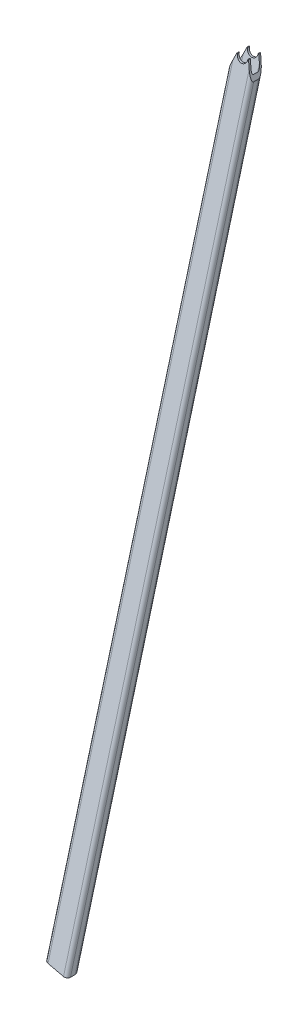
ISO-10303-21;
HEADER;
FILE_DESCRIPTION(('STEP AP214'),'2;1');
FILE_NAME('part.step','',(''),(''),'','','');
FILE_SCHEMA(('AUTOMOTIVE_DESIGN { 1 0 10303 214 1 1 1 1 }'));
ENDSEC;
DATA;
#1=APPLICATION_CONTEXT('core data for automotive mechanical design processes');
#2=APPLICATION_PROTOCOL_DEFINITION('international standard','automotive_design',2000,#1);
#3=PRODUCT_CONTEXT('',#1,'mechanical');
#4=PRODUCT('Part','Part','',(#3));
#5=PRODUCT_RELATED_PRODUCT_CATEGORY('part','',(#4));
#6=PRODUCT_DEFINITION_FORMATION('','',#4);
#7=PRODUCT_DEFINITION_CONTEXT('part definition',#1,'design');
#8=PRODUCT_DEFINITION('design','',#6,#7);
#9=PRODUCT_DEFINITION_SHAPE('','',#8);
#10=(LENGTH_UNIT() NAMED_UNIT(*) SI_UNIT(.MILLI.,.METRE.));
#11=(NAMED_UNIT(*) PLANE_ANGLE_UNIT() SI_UNIT($,.RADIAN.));
#12=(NAMED_UNIT(*) SI_UNIT($,.STERADIAN.) SOLID_ANGLE_UNIT());
#13=UNCERTAINTY_MEASURE_WITH_UNIT(LENGTH_MEASURE(1.E-05),#10,'distance_accuracy_value','');
#14=(GEOMETRIC_REPRESENTATION_CONTEXT(3) GLOBAL_UNCERTAINTY_ASSIGNED_CONTEXT((#13)) GLOBAL_UNIT_ASSIGNED_CONTEXT((#10,
#11,#12)) REPRESENTATION_CONTEXT('',''));
#15=CARTESIAN_POINT('',(0.,0.,0.));
#16=DIRECTION('',(0.,0.,1.));
#17=DIRECTION('',(1.,0.,0.));
#18=AXIS2_PLACEMENT_3D('',#15,#16,#17);
#19=CARTESIAN_POINT('',(0.,0.,0.));
#20=DIRECTION('',(0.,1.,0.));
#21=DIRECTION('',(0.,0.,1.));
#22=AXIS2_PLACEMENT_3D('',#19,#20,#21);
#23=PLANE('',#22);
#24=DIRECTION('',(1.,0.,0.));
#25=VECTOR('',#24,1.);
#26=CARTESIAN_POINT('',(0.,0.,10.3527618041008));
#27=LINE('',#26,#25);
#28=CARTESIAN_POINT('',(9.,0.,10.3527618041008));
#29=VERTEX_POINT('',#28);
#30=CARTESIAN_POINT('',(9.99999999999981,0.,10.3527618041008));
#31=VERTEX_POINT('',#30);
#32=EDGE_CURVE('E264',#29,#31,#27,.T.);
#33=ORIENTED_EDGE('',*,*,#32,.T.);
#34=DIRECTION('',(0.,0.,-1.));
#35=VECTOR('',#34,1.);
#36=CARTESIAN_POINT('',(9.99999999999981,0.,0.));
#37=LINE('',#36,#35);
#38=CARTESIAN_POINT('',(9.99999999999981,0.,7.24693326287058));
#39=VERTEX_POINT('',#38);
#40=EDGE_CURVE('E228',#31,#39,#37,.T.);
#41=ORIENTED_EDGE('',*,*,#40,.T.);
#42=DIRECTION('',(1.,0.,0.));
#43=VECTOR('',#42,1.);
#44=CARTESIAN_POINT('',(0.,0.,7.24693326287058));
#45=LINE('',#44,#43);
#46=CARTESIAN_POINT('',(9.,0.,7.24693326287058));
#47=VERTEX_POINT('',#46);
#48=EDGE_CURVE('E211',#47,#39,#45,.T.);
#49=ORIENTED_EDGE('',*,*,#48,.F.);
#50=DIRECTION('',(0.,0.,1.));
#51=VECTOR('',#50,1.);
#52=CARTESIAN_POINT('',(9.,0.,-10.3527618041008));
#53=LINE('',#52,#51);
#54=EDGE_CURVE('E225',#29,#47,#53,.F.);
#55=ORIENTED_EDGE('',*,*,#54,.F.);
#56=EDGE_LOOP('',(#33,#41,#49,#55));
#57=FACE_BOUND('',#56,.T.);
#58=ADVANCED_FACE('F43',(#57),#23,.T.);
#59=DIRECTION('',(1.,0.,0.));
#60=VECTOR('',#59,1.);
#61=CARTESIAN_POINT('',(0.,0.,-10.3527618041008));
#62=LINE('',#61,#60);
#63=CARTESIAN_POINT('',(-9.99999999999981,0.,-10.3527618041008));
#64=VERTEX_POINT('',#63);
#65=CARTESIAN_POINT('',(-9.,0.,-10.3527618041008));
#66=VERTEX_POINT('',#65);
#67=EDGE_CURVE('E269',#64,#66,#62,.T.);
#68=ORIENTED_EDGE('',*,*,#67,.F.);
#69=DIRECTION('',(0.,0.,1.));
#70=VECTOR('',#69,1.);
#71=CARTESIAN_POINT('',(-9.99999999999981,0.,0.));
#72=LINE('',#71,#70);
#73=CARTESIAN_POINT('',(-9.99999999999981,0.,-7.24693326287058));
#74=VERTEX_POINT('',#73);
#75=EDGE_CURVE('E336',#64,#74,#72,.T.);
#76=ORIENTED_EDGE('',*,*,#75,.T.);
#77=DIRECTION('',(1.,0.,0.));
#78=VECTOR('',#77,1.);
#79=CARTESIAN_POINT('',(0.,0.,-7.24693326287058));
#80=LINE('',#79,#78);
#81=CARTESIAN_POINT('',(-9.,0.,-7.24693326287058));
#82=VERTEX_POINT('',#81);
#83=EDGE_CURVE('E444',#74,#82,#80,.T.);
#84=ORIENTED_EDGE('',*,*,#83,.T.);
#85=DIRECTION('',(0.,0.,1.));
#86=VECTOR('',#85,1.);
#87=CARTESIAN_POINT('',(-9.,0.,-10.3527618041008));
#88=LINE('',#87,#86);
#89=EDGE_CURVE('E241',#66,#82,#88,.T.);
#90=ORIENTED_EDGE('',*,*,#89,.F.);
#91=EDGE_LOOP('',(#68,#76,#84,#90));
#92=FACE_BOUND('',#91,.T.);
#93=ADVANCED_FACE('F524',(#92),#23,.T.);
#94=DIRECTION('',(1.,0.,0.));
#95=VECTOR('',#94,1.);
#96=CARTESIAN_POINT('',(0.,0.,7.24693326287058));
#97=LINE('',#96,#95);
#98=CARTESIAN_POINT('',(-9.99999999999981,0.,7.24693326287058));
#99=VERTEX_POINT('',#98);
#100=CARTESIAN_POINT('',(-9.,0.,7.24693326287058));
#101=VERTEX_POINT('',#100);
#102=EDGE_CURVE('E214',#99,#101,#97,.T.);
#103=ORIENTED_EDGE('',*,*,#102,.F.);
#104=DIRECTION('',(0.,0.,1.));
#105=VECTOR('',#104,1.);
#106=CARTESIAN_POINT('',(-9.99999999999981,0.,0.));
#107=LINE('',#106,#105);
#108=CARTESIAN_POINT('',(-9.99999999999981,0.,10.3527618041008));
#109=VERTEX_POINT('',#108);
#110=EDGE_CURVE('E333',#99,#109,#107,.T.);
#111=ORIENTED_EDGE('',*,*,#110,.T.);
#112=CARTESIAN_POINT('',(-9.,0.,10.3527618041008));
#113=VERTEX_POINT('',#112);
#114=EDGE_CURVE('E265',#109,#113,#27,.T.);
#115=ORIENTED_EDGE('',*,*,#114,.T.);
#116=EDGE_CURVE('E236',#101,#113,#88,.T.);
#117=ORIENTED_EDGE('',*,*,#116,.F.);
#118=EDGE_LOOP('',(#103,#111,#115,#117));
#119=FACE_BOUND('',#118,.T.);
#120=ADVANCED_FACE('F483',(#119),#23,.T.);
#121=CARTESIAN_POINT('',(0.,0.,-10.3527618041008));
#122=DIRECTION('',(0.,0.,1.));
#123=DIRECTION('',(1.,0.,0.));
#124=AXIS2_PLACEMENT_3D('',#121,#122,#123);
#125=CYLINDRICAL_SURFACE('',#124,9.);
#126=CARTESIAN_POINT('',(0.,0.,-7.24693326287058));
#127=DIRECTION('',(0.,-0.258819045102521,-0.965925826289068));
#128=DIRECTION('',(0.,-0.965925826289068,0.258819045102521));
#129=AXIS2_PLACEMENT_3D('',#126,#127,#128);
#130=ELLIPSE('',#129,9.31748562369075,9.);
#131=CARTESIAN_POINT('',(9.,0.,-7.24693326287058));
#132=VERTEX_POINT('',#131);
#133=EDGE_CURVE('E243',#132,#82,#130,.T.);
#134=ORIENTED_EDGE('',*,*,#133,.F.);
#135=CARTESIAN_POINT('',(9.,0.,-10.3527618041008));
#136=VERTEX_POINT('',#135);
#137=EDGE_CURVE('E237',#132,#136,#53,.F.);
#138=ORIENTED_EDGE('',*,*,#137,.T.);
#139=CARTESIAN_POINT('',(0.,0.,-10.3527618041008));
#140=DIRECTION('',(0.,-0.258819045102521,-0.965925826289068));
#141=DIRECTION('',(0.,-0.965925826289068,0.258819045102521));
#142=AXIS2_PLACEMENT_3D('',#139,#140,#141);
#143=ELLIPSE('',#142,9.31748562369075,9.);
#144=EDGE_CURVE('E316',#136,#66,#143,.T.);
#145=ORIENTED_EDGE('',*,*,#144,.T.);
#146=ORIENTED_EDGE('',*,*,#89,.T.);
#147=EDGE_LOOP('',(#134,#138,#145,#146));
#148=FACE_BOUND('',#147,.T.);
#149=ADVANCED_FACE('F533',(#148),#125,.F.);
#150=DIRECTION('',(1.,0.,0.));
#151=VECTOR('',#150,1.);
#152=CARTESIAN_POINT('',(0.,0.,-7.24693326287058));
#153=LINE('',#152,#151);
#154=CARTESIAN_POINT('',(9.99999999999981,0.,-7.24693326287058));
#155=VERTEX_POINT('',#154);
#156=EDGE_CURVE('E413',#132,#155,#153,.T.);
#157=ORIENTED_EDGE('',*,*,#156,.T.);
#158=DIRECTION('',(0.,0.,-1.));
#159=VECTOR('',#158,1.);
#160=CARTESIAN_POINT('',(9.99999999999981,0.,0.));
#161=LINE('',#160,#159);
#162=CARTESIAN_POINT('',(9.99999999999981,0.,-10.3527618041008));
#163=VERTEX_POINT('',#162);
#164=EDGE_CURVE('E376',#155,#163,#161,.T.);
#165=ORIENTED_EDGE('',*,*,#164,.T.);
#166=EDGE_CURVE('E268',#136,#163,#62,.T.);
#167=ORIENTED_EDGE('',*,*,#166,.F.);
#168=ORIENTED_EDGE('',*,*,#137,.F.);
#169=EDGE_LOOP('',(#157,#165,#167,#168));
#170=FACE_BOUND('',#169,.T.);
#171=ADVANCED_FACE('F411',(#170),#23,.T.);
#172=CARTESIAN_POINT('',(-20.,21.9067069768066,4.48287736084025));
#173=DIRECTION('',(-1.,0.,0.));
#174=DIRECTION('',(0.,0.,1.));
#175=AXIS2_PLACEMENT_3D('',#172,#173,#174);
#176=PLANE('',#175);
#177=DIRECTION('',(0.,0.965925826289068,-0.258819045102521));
#178=VECTOR('',#177,1.);
#179=CARTESIAN_POINT('',(-20.,-1.55291427061513,4.55720684636642));
#180=LINE('',#179,#178);
#181=CARTESIAN_POINT('',(-20.,-1196.47346038583,324.735202197295));
#182=VERTEX_POINT('',#181);
#183=CARTESIAN_POINT('',(-20.,-27.474774194547,11.5029482792967));
#184=VERTEX_POINT('',#183);
#185=EDGE_CURVE('E283',#182,#184,#180,.T.);
#186=ORIENTED_EDGE('',*,*,#185,.T.);
#187=DIRECTION('',(0.,0.,-1.));
#188=VECTOR('',#187,1.);
#189=CARTESIAN_POINT('',(-20.,-27.474774194547,4.48287736084025));
#190=LINE('',#189,#188);
#191=CARTESIAN_POINT('',(-20.,-27.474774194547,3.22073883601606));
#192=VERTEX_POINT('',#191);
#193=EDGE_CURVE('E320',#184,#192,#190,.T.);
#194=ORIENTED_EDGE('',*,*,#193,.T.);
#195=DIRECTION('',(0.,0.965925826289068,-0.258819045102521));
#196=VECTOR('',#195,1.);
#197=CARTESIAN_POINT('',(-20.,18.2832403453713,-9.04008420720666));
#198=LINE('',#197,#196);
#199=CARTESIAN_POINT('',(-20.,-1196.47346038583,316.452992754015));
#200=VERTEX_POINT('',#199);
#201=EDGE_CURVE('E287',#192,#200,#198,.F.);
#202=ORIENTED_EDGE('',*,*,#201,.T.);
#203=DIRECTION('',(0.,0.,-1.));
#204=VECTOR('',#203,1.);
#205=CARTESIAN_POINT('',(-20.,-1196.47346038583,4.48287736084025));
#206=LINE('',#205,#204);
#207=EDGE_CURVE('E256',#182,#200,#206,.T.);
#208=ORIENTED_EDGE('',*,*,#207,.F.);
#209=EDGE_LOOP('',(#186,#194,#202,#208));
#210=FACE_BOUND('',#209,.T.);
#211=ADVANCED_FACE('F495',(#210),#176,.T.);
#212=CARTESIAN_POINT('',(20.,21.9067069768066,4.48287736084025));
#213=DIRECTION('',(1.,0.,0.));
#214=DIRECTION('',(0.,0.,-1.));
#215=AXIS2_PLACEMENT_3D('',#212,#213,#214);
#216=PLANE('',#215);
#217=DIRECTION('',(0.,-0.965925826289068,0.258819045102521));
#218=VECTOR('',#217,1.);
#219=CARTESIAN_POINT('',(20.,18.2832403453713,-9.0400842072067));
#220=LINE('',#219,#218);
#221=CARTESIAN_POINT('',(20.,-1203.52653961417,318.342859637401));
#222=VERTEX_POINT('',#221);
#223=CARTESIAN_POINT('',(20.,-27.474774194547,3.22073883601601));
#224=VERTEX_POINT('',#223);
#225=EDGE_CURVE('E305',#222,#224,#220,.F.);
#226=ORIENTED_EDGE('',*,*,#225,.T.);
#227=DIRECTION('',(0.,0.,1.));
#228=VECTOR('',#227,1.);
#229=CARTESIAN_POINT('',(20.,-27.474774194547,4.48287736084025));
#230=LINE('',#229,#228);
#231=CARTESIAN_POINT('',(20.,-27.4747741945467,11.5029482792966));
#232=VERTEX_POINT('',#231);
#233=EDGE_CURVE('E369',#224,#232,#230,.T.);
#234=ORIENTED_EDGE('',*,*,#233,.T.);
#235=DIRECTION('',(0.,-0.965925826289068,0.258819045102521));
#236=VECTOR('',#235,1.);
#237=CARTESIAN_POINT('',(20.,-1205.07945388479,327.041171205408));
#238=LINE('',#237,#236);
#239=CARTESIAN_POINT('',(20.,-1203.52653961417,326.625069080681));
#240=VERTEX_POINT('',#239);
#241=EDGE_CURVE('E302',#232,#240,#238,.T.);
#242=ORIENTED_EDGE('',*,*,#241,.T.);
#243=DIRECTION('',(0.,0.,1.));
#244=VECTOR('',#243,1.);
#245=CARTESIAN_POINT('',(20.,-1203.52653961417,4.48287736084025));
#246=LINE('',#245,#244);
#247=EDGE_CURVE('E252',#222,#240,#246,.T.);
#248=ORIENTED_EDGE('',*,*,#247,.F.);
#249=EDGE_LOOP('',(#226,#234,#242,#248));
#250=FACE_BOUND('',#249,.T.);
#251=ADVANCED_FACE('F508',(#250),#216,.T.);
#252=CARTESIAN_POINT('',(0.,2.58819045102521,9.65925826289068));
#253=DIRECTION('',(0.,-0.258819045102521,-0.965925826289068));
#254=DIRECTION('',(0.,0.965925826289068,-0.258819045102521));
#255=AXIS2_PLACEMENT_3D('',#252,#253,#254);
#256=PLANE('',#255);
#257=ORIENTED_EDGE('',*,*,#114,.F.);
#258=DIRECTION('',(0.331668125174636,0.91125068467017,-0.24416888505968));
#259=VECTOR('',#258,1.);
#260=CARTESIAN_POINT('',(-18.9284544905438,-24.530727103398,16.9257503212046));
#261=LINE('',#260,#259);
#262=CARTESIAN_POINT('',(-14.,-10.989909677819,13.2974992271634));
#263=VERTEX_POINT('',#262);
#264=EDGE_CURVE('E363',#109,#263,#261,.F.);
#265=ORIENTED_EDGE('',*,*,#264,.T.);
#266=DIRECTION('',(0.,0.965925826289068,-0.258819045102521));
#267=VECTOR('',#266,1.);
#268=CARTESIAN_POINT('',(-14.,-1196.47346038583,330.946859279756));
#269=LINE('',#268,#267);
#270=CARTESIAN_POINT('',(-14.,-1197.53142227008,331.230339312264));
#271=VERTEX_POINT('',#270);
#272=EDGE_CURVE('E309',#263,#271,#269,.F.);
#273=ORIENTED_EDGE('',*,*,#272,.T.);
#274=DIRECTION('',(0.983743457179398,-0.173460513596151,0.0464786045367765));
#275=VECTOR('',#274,1.);
#276=CARTESIAN_POINT('',(-219.943870504276,-1161.21796138865,321.500176794704));
#277=LINE('',#276,#275);
#278=CARTESIAN_POINT('',(14.0000000000001,-1202.46857772992,332.553246130634));
#279=VERTEX_POINT('',#278);
#280=EDGE_CURVE('E260',#271,#279,#277,.T.);
#281=ORIENTED_EDGE('',*,*,#280,.T.);
#282=DIRECTION('',(0.,-0.965925826289068,0.258819045102521));
#283=VECTOR('',#282,1.);
#284=CARTESIAN_POINT('',(14.,0.,10.3527618041008));
#285=LINE('',#284,#283);
#286=CARTESIAN_POINT('',(14.,-10.9899096778191,13.2974992271635));
#287=VERTEX_POINT('',#286);
#288=EDGE_CURVE('E312',#279,#287,#285,.F.);
#289=ORIENTED_EDGE('',*,*,#288,.T.);
#290=DIRECTION('',(0.331668125174636,-0.91125068467017,0.24416888505968));
#291=VECTOR('',#290,1.);
#292=CARTESIAN_POINT('',(18.9284544905438,-24.530727103398,16.9257503212046));
#293=LINE('',#292,#291);
#294=EDGE_CURVE('E360',#287,#31,#293,.F.);
#295=ORIENTED_EDGE('',*,*,#294,.T.);
#296=ORIENTED_EDGE('',*,*,#32,.F.);
#297=CARTESIAN_POINT('',(0.,0.,10.3527618041008));
#298=DIRECTION('',(0.,-0.258819045102521,-0.965925826289068));
#299=DIRECTION('',(0.,-0.965925826289068,0.258819045102521));
#300=AXIS2_PLACEMENT_3D('',#297,#298,#299);
#301=ELLIPSE('',#300,9.31748562369075,9.);
#302=EDGE_CURVE('E234',#29,#113,#301,.T.);
#303=ORIENTED_EDGE('',*,*,#302,.T.);
#304=EDGE_LOOP('',(#257,#265,#273,#281,#289,#295,#296,#303));
#305=FACE_BOUND('',#304,.T.);
#306=ADVANCED_FACE('F484',(#305),#256,.F.);
#307=CARTESIAN_POINT('',(0.,-2.58819045102521,-9.65925826289068));
#308=DIRECTION('',(0.,-0.258819045102521,-0.965925826289068));
#309=DIRECTION('',(0.,0.965925826289068,-0.258819045102521));
#310=AXIS2_PLACEMENT_3D('',#307,#308,#309);
#311=PLANE('',#310);
#312=DIRECTION('',(0.,0.965925826289068,-0.258819045102521));
#313=VECTOR('',#312,1.);
#314=CARTESIAN_POINT('',(-14.,-2.58819045102521,-9.65925826289068));
#315=LINE('',#314,#313);
#316=CARTESIAN_POINT('',(-14.,-1197.53142227008,310.524815704062));
#317=VERTEX_POINT('',#316);
#318=CARTESIAN_POINT('',(-14.,-10.9899096778191,-7.40802438103821));
#319=VERTEX_POINT('',#318);
#320=EDGE_CURVE('E279',#317,#319,#315,.T.);
#321=ORIENTED_EDGE('',*,*,#320,.T.);
#322=DIRECTION('',(-0.331668125174636,-0.91125068467017,0.24416888505968));
#323=VECTOR('',#322,1.);
#324=CARTESIAN_POINT('',(-9.73836063276715,0.718848253512128,-10.5453766131099));
#325=LINE('',#324,#323);
#326=EDGE_CURVE('E330',#319,#64,#325,.F.);
#327=ORIENTED_EDGE('',*,*,#326,.T.);
#328=ORIENTED_EDGE('',*,*,#67,.T.);
#329=ORIENTED_EDGE('',*,*,#144,.F.);
#330=ORIENTED_EDGE('',*,*,#166,.T.);
#331=DIRECTION('',(-0.331668125174636,0.91125068467017,-0.24416888505968));
#332=VECTOR('',#331,1.);
#333=CARTESIAN_POINT('',(9.73836063276715,0.718848253512128,-10.5453766131099));
#334=LINE('',#333,#332);
#335=CARTESIAN_POINT('',(14.,-10.9899096778191,-7.40802438103821));
#336=VERTEX_POINT('',#335);
#337=EDGE_CURVE('E327',#163,#336,#334,.F.);
#338=ORIENTED_EDGE('',*,*,#337,.T.);
#339=DIRECTION('',(0.,-0.965925826289068,0.258819045102521));
#340=VECTOR('',#339,1.);
#341=CARTESIAN_POINT('',(14.,-2.58819045102521,-9.65925826289068));
#342=LINE('',#341,#340);
#343=CARTESIAN_POINT('',(14.0000000000001,-1202.46857772992,311.847722522432));
#344=VERTEX_POINT('',#343);
#345=EDGE_CURVE('E276',#336,#344,#342,.T.);
#346=ORIENTED_EDGE('',*,*,#345,.T.);
#347=DIRECTION('',(0.983743457179398,-0.173460513596151,0.0464786045367765));
#348=VECTOR('',#347,1.);
#349=CARTESIAN_POINT('',(-218.997151369795,-1161.38489351521,300.839382515006));
#350=LINE('',#349,#348);
#351=EDGE_CURVE('E272',#317,#344,#350,.T.);
#352=ORIENTED_EDGE('',*,*,#351,.F.);
#353=EDGE_LOOP('',(#321,#327,#328,#329,#330,#338,#346,#352));
#354=FACE_BOUND('',#353,.T.);
#355=ADVANCED_FACE('F416',(#354),#311,.T.);
#356=CARTESIAN_POINT('',(-205.212085995402,-1163.81557247155,0.));
#357=DIRECTION('',(0.173648177666931,0.984807753012208,0.));
#358=DIRECTION('',(-0.984807753012208,0.173648177666931,0.));
#359=AXIS2_PLACEMENT_3D('',#356,#357,#358);
#360=PLANE('',#359);
#361=DIRECTION('',(0.,0.,-1.));
#362=VECTOR('',#361,1.);
#363=CARTESIAN_POINT('',(-17.,-1197.00244132796,4.48287736084025));
#364=LINE('',#363,#362);
#365=CARTESIAN_POINT('',(-17.,-1197.00244132796,324.876942213549));
#366=VERTEX_POINT('',#365);
#367=CARTESIAN_POINT('',(-17.,-1197.00244132796,316.594732770269));
#368=VERTEX_POINT('',#367);
#369=EDGE_CURVE('E448',#366,#368,#364,.T.);
#370=ORIENTED_EDGE('',*,*,#369,.F.);
#371=CARTESIAN_POINT('',(-14.,-1197.53142227008,325.018682229803));
#372=DIRECTION('',(0.173648177666931,0.984807753012208,0.));
#373=DIRECTION('',(0.535583384778492,-0.0944378011556117,0.839185283273073));
#374=AXIS2_PLACEMENT_3D('',#371,#372,#373);
#375=ELLIPSE('',#374,3.15374095271948,3.);
#376=CARTESIAN_POINT('',(-14.,-1197.53142227008,328.124510771034));
#377=VERTEX_POINT('',#376);
#378=EDGE_CURVE('E245',#377,#366,#375,.F.);
#379=ORIENTED_EDGE('',*,*,#378,.F.);
#380=DIRECTION('',(0.983743457179398,-0.173460513596151,0.0464786045367765));
#381=VECTOR('',#380,1.);
#382=CARTESIAN_POINT('',(-219.801862634104,-1161.24300120763,318.40105765275));
#383=LINE('',#382,#381);
#384=CARTESIAN_POINT('',(14.0000000000001,-1202.46857772992,329.447417589404));
#385=VERTEX_POINT('',#384);
#386=EDGE_CURVE('E230',#377,#385,#383,.T.);
#387=ORIENTED_EDGE('',*,*,#386,.T.);
#388=CARTESIAN_POINT('',(14.,-1202.46857772992,326.341589048174));
#389=DIRECTION('',(0.173648177666931,0.984807753012208,0.));
#390=DIRECTION('',(-0.535583384778492,0.0944378011556117,-0.839185283273073));
#391=AXIS2_PLACEMENT_3D('',#388,#389,#390);
#392=ELLIPSE('',#391,3.15374095271948,3.);
#393=CARTESIAN_POINT('',(17.,-1202.99755867204,326.483329064427));
#394=VERTEX_POINT('',#393);
#395=EDGE_CURVE('E428',#394,#385,#392,.F.);
#396=ORIENTED_EDGE('',*,*,#395,.F.);
#397=DIRECTION('',(0.,0.,1.));
#398=VECTOR('',#397,1.);
#399=CARTESIAN_POINT('',(17.,-1202.99755867204,4.48287736084025));
#400=LINE('',#399,#398);
#401=CARTESIAN_POINT('',(17.,-1202.99755867204,318.201119621147));
#402=VERTEX_POINT('',#401);
#403=EDGE_CURVE('E220',#402,#394,#400,.T.);
#404=ORIENTED_EDGE('',*,*,#403,.F.);
#405=CARTESIAN_POINT('',(14.,-1202.46857772992,318.059379604893));
#406=DIRECTION('',(0.173648177666931,0.984807753012208,0.));
#407=DIRECTION('',(0.535583384778492,-0.0944378011556117,0.839185283273073));
#408=AXIS2_PLACEMENT_3D('',#405,#406,#407);
#409=ELLIPSE('',#408,3.15374095271948,3.);
#410=CARTESIAN_POINT('',(14.,-1202.46857772992,314.953551063663));
#411=VERTEX_POINT('',#410);
#412=EDGE_CURVE('E455',#411,#402,#409,.F.);
#413=ORIENTED_EDGE('',*,*,#412,.F.);
#414=DIRECTION('',(0.983743457179398,-0.173460513596151,0.0464786045367765));
#415=VECTOR('',#414,1.);
#416=CARTESIAN_POINT('',(-219.139159239967,-1161.35985369623,303.93850165696));
#417=LINE('',#416,#415);
#418=CARTESIAN_POINT('',(-14.,-1197.53142227008,313.630644245292));
#419=VERTEX_POINT('',#418);
#420=EDGE_CURVE('E400',#419,#411,#417,.T.);
#421=ORIENTED_EDGE('',*,*,#420,.F.);
#422=CARTESIAN_POINT('',(-14.,-1197.53142227008,316.736472786523));
#423=DIRECTION('',(0.173648177666931,0.984807753012208,0.));
#424=DIRECTION('',(-0.535583384778492,0.0944378011556117,-0.839185283273073));
#425=AXIS2_PLACEMENT_3D('',#422,#423,#424);
#426=ELLIPSE('',#425,3.15374095271948,3.);
#427=EDGE_CURVE('E452',#368,#419,#426,.F.);
#428=ORIENTED_EDGE('',*,*,#427,.F.);
#429=EDGE_LOOP('',(#370,#379,#387,#396,#404,#413,#421,#428));
#430=FACE_BOUND('',#429,.T.);
#431=ORIENTED_EDGE('',*,*,#207,.T.);
#432=CARTESIAN_POINT('',(-14.,-1197.53142227008,316.736472786523));
#433=DIRECTION('',(0.173648177666931,0.984807753012208,0.));
#434=DIRECTION('',(-0.535583384778492,0.0944378011556117,-0.839185283273073));
#435=AXIS2_PLACEMENT_3D('',#432,#433,#434);
#436=ELLIPSE('',#435,6.30748190543896,6.);
#437=EDGE_CURVE('E299',#200,#317,#436,.F.);
#438=ORIENTED_EDGE('',*,*,#437,.T.);
#439=ORIENTED_EDGE('',*,*,#351,.T.);
#440=CARTESIAN_POINT('',(14.,-1202.46857772992,318.059379604893));
#441=DIRECTION('',(0.173648177666931,0.984807753012208,0.));
#442=DIRECTION('',(0.535583384778492,-0.0944378011556117,0.839185283273073));
#443=AXIS2_PLACEMENT_3D('',#440,#441,#442);
#444=ELLIPSE('',#443,6.30748190543896,6.);
#445=EDGE_CURVE('E296',#344,#222,#444,.F.);
#446=ORIENTED_EDGE('',*,*,#445,.T.);
#447=ORIENTED_EDGE('',*,*,#247,.T.);
#448=CARTESIAN_POINT('',(14.,-1202.46857772992,326.341589048174));
#449=DIRECTION('',(0.173648177666931,0.984807753012208,0.));
#450=DIRECTION('',(-0.535583384778492,0.0944378011556117,-0.839185283273073));
#451=AXIS2_PLACEMENT_3D('',#448,#449,#450);
#452=ELLIPSE('',#451,6.30748190543896,6.);
#453=EDGE_CURVE('E293',#240,#279,#452,.F.);
#454=ORIENTED_EDGE('',*,*,#453,.T.);
#455=ORIENTED_EDGE('',*,*,#280,.F.);
#456=CARTESIAN_POINT('',(-14.,-1197.53142227008,325.018682229803));
#457=DIRECTION('',(0.173648177666931,0.984807753012208,0.));
#458=DIRECTION('',(0.535583384778492,-0.0944378011556117,0.839185283273073));
#459=AXIS2_PLACEMENT_3D('',#456,#457,#458);
#460=ELLIPSE('',#459,6.30748190543896,6.);
#461=EDGE_CURVE('E290',#271,#182,#460,.F.);
#462=ORIENTED_EDGE('',*,*,#461,.T.);
#463=EDGE_LOOP('',(#431,#438,#439,#446,#447,#454,#455,#462));
#464=FACE_BOUND('',#463,.T.);
#465=ADVANCED_FACE('F468',(#430,#464),#360,.F.);
#466=CARTESIAN_POINT('',(-14.,-1.03527618041009,-3.86370330515627));
#467=DIRECTION('',(0.,0.965925826289068,-0.258819045102521));
#468=DIRECTION('',(0.,0.258819045102521,0.965925826289068));
#469=AXIS2_PLACEMENT_3D('',#466,#467,#468);
#470=CYLINDRICAL_SURFACE('',#469,6.);
#471=ORIENTED_EDGE('',*,*,#201,.F.);
#472=CARTESIAN_POINT('',(-14.,-10.9899096778191,-1.19636729857771));
#473=DIRECTION('',(0.939692620785909,-0.342020143325666,0.));
#474=DIRECTION('',(0.328909923583208,0.903672588079418,-0.27421545492976));
#475=AXIS2_PLACEMENT_3D('',#472,#473,#474);
#476=ELLIPSE('',#475,18.1616703100024,6.);
#477=EDGE_CURVE('E324',#192,#319,#476,.T.);
#478=ORIENTED_EDGE('',*,*,#477,.T.);
#479=ORIENTED_EDGE('',*,*,#320,.F.);
#480=ORIENTED_EDGE('',*,*,#437,.F.);
#481=EDGE_LOOP('',(#471,#478,#479,#480));
#482=FACE_BOUND('',#481,.T.);
#483=ADVANCED_FACE('F499',(#482),#470,.T.);
#484=CARTESIAN_POINT('',(14.,-1.03527618041009,-3.86370330515627));
#485=DIRECTION('',(0.,-0.965925826289068,0.258819045102521));
#486=DIRECTION('',(0.,-0.258819045102521,-0.965925826289068));
#487=AXIS2_PLACEMENT_3D('',#484,#485,#486);
#488=CYLINDRICAL_SURFACE('',#487,6.);
#489=ORIENTED_EDGE('',*,*,#345,.F.);
#490=CARTESIAN_POINT('',(14.,-10.9899096778191,-1.19636729857771));
#491=DIRECTION('',(-0.939692620785909,-0.342020143325666,0.));
#492=DIRECTION('',(0.328909923583208,-0.903672588079418,0.27421545492976));
#493=AXIS2_PLACEMENT_3D('',#490,#491,#492);
#494=ELLIPSE('',#493,18.1616703100024,6.);
#495=EDGE_CURVE('E12',#336,#224,#494,.T.);
#496=ORIENTED_EDGE('',*,*,#495,.T.);
#497=ORIENTED_EDGE('',*,*,#225,.F.);
#498=ORIENTED_EDGE('',*,*,#445,.F.);
#499=EDGE_LOOP('',(#489,#496,#497,#498));
#500=FACE_BOUND('',#499,.T.);
#501=ADVANCED_FACE('F505',(#500),#488,.T.);
#502=CARTESIAN_POINT('',(14.,20.3537927061915,-1.31267759689415));
#503=DIRECTION('',(0.,0.965925826289068,-0.258819045102521));
#504=DIRECTION('',(0.,0.258819045102521,0.965925826289068));
#505=AXIS2_PLACEMENT_3D('',#502,#503,#504);
#506=CYLINDRICAL_SURFACE('',#505,6.);
#507=ORIENTED_EDGE('',*,*,#241,.F.);
#508=CARTESIAN_POINT('',(14.,-10.9899096778191,7.08584214470295));
#509=DIRECTION('',(-0.939692620785909,-0.342020143325666,0.));
#510=DIRECTION('',(-0.328909923583208,0.903672588079418,-0.27421545492976));
#511=AXIS2_PLACEMENT_3D('',#508,#509,#510);
#512=ELLIPSE('',#511,18.1616703100024,6.);
#513=EDGE_CURVE('E373',#232,#287,#512,.T.);
#514=ORIENTED_EDGE('',*,*,#513,.T.);
#515=ORIENTED_EDGE('',*,*,#288,.F.);
#516=ORIENTED_EDGE('',*,*,#453,.F.);
#517=EDGE_LOOP('',(#507,#514,#515,#516));
#518=FACE_BOUND('',#517,.T.);
#519=ADVANCED_FACE('F514',(#518),#506,.T.);
#520=CARTESIAN_POINT('',(-14.,20.3537927061915,-1.31267759689415));
#521=DIRECTION('',(0.,-0.965925826289068,0.258819045102521));
#522=DIRECTION('',(0.,-0.258819045102521,-0.965925826289068));
#523=AXIS2_PLACEMENT_3D('',#520,#521,#522);
#524=CYLINDRICAL_SURFACE('',#523,6.);
#525=ORIENTED_EDGE('',*,*,#272,.F.);
#526=CARTESIAN_POINT('',(-14.,-10.9899096778191,7.08584214470295));
#527=DIRECTION('',(0.939692620785909,-0.342020143325666,0.));
#528=DIRECTION('',(-0.328909923583208,-0.903672588079418,0.27421545492976));
#529=AXIS2_PLACEMENT_3D('',#526,#527,#528);
#530=ELLIPSE('',#529,18.1616703100024,6.);
#531=EDGE_CURVE('E366',#263,#184,#530,.T.);
#532=ORIENTED_EDGE('',*,*,#531,.T.);
#533=ORIENTED_EDGE('',*,*,#185,.F.);
#534=ORIENTED_EDGE('',*,*,#461,.F.);
#535=EDGE_LOOP('',(#525,#532,#533,#534));
#536=FACE_BOUND('',#535,.T.);
#537=ADVANCED_FACE('F489',(#536),#524,.T.);
#538=ORIENTED_EDGE('',*,*,#54,.T.);
#539=CARTESIAN_POINT('',(0.,0.,7.24693326287058));
#540=DIRECTION('',(0.,-0.258819045102521,-0.965925826289068));
#541=DIRECTION('',(0.,-0.965925826289068,0.258819045102521));
#542=AXIS2_PLACEMENT_3D('',#539,#540,#541);
#543=ELLIPSE('',#542,9.31748562369075,9.);
#544=EDGE_CURVE('E207',#47,#101,#543,.T.);
#545=ORIENTED_EDGE('',*,*,#544,.T.);
#546=ORIENTED_EDGE('',*,*,#116,.T.);
#547=ORIENTED_EDGE('',*,*,#302,.F.);
#548=EDGE_LOOP('',(#538,#545,#546,#547));
#549=FACE_BOUND('',#548,.T.);
#550=ADVANCED_FACE('F232',(#549),#125,.F.);
#551=CARTESIAN_POINT('',(-17.,21.9067069768066,4.48287736084025));
#552=DIRECTION('',(-1.,0.,0.));
#553=DIRECTION('',(0.,0.,1.));
#554=AXIS2_PLACEMENT_3D('',#551,#552,#553);
#555=PLANE('',#554);
#556=DIRECTION('',(0.,0.965925826289068,-0.258819045102521));
#557=VECTOR('',#556,1.);
#558=CARTESIAN_POINT('',(-17.,-1.03527618041008,-3.86370330515625));
#559=LINE('',#558,#557);
#560=CARTESIAN_POINT('',(-17.,-19.2323419361831,1.01218576871918));
#561=VERTEX_POINT('',#560);
#562=EDGE_CURVE('E725',#561,#368,#559,.F.);
#563=ORIENTED_EDGE('',*,*,#562,.F.);
#564=DIRECTION('',(0.,0.,-1.));
#565=VECTOR('',#564,1.);
#566=CARTESIAN_POINT('',(-17.,-19.2323419361831,4.48287736084025));
#567=LINE('',#566,#565);
#568=CARTESIAN_POINT('',(-17.,-19.2323419361831,9.29439521199982));
#569=VERTEX_POINT('',#568);
#570=EDGE_CURVE('E348',#561,#569,#567,.F.);
#571=ORIENTED_EDGE('',*,*,#570,.T.);
#572=DIRECTION('',(0.,-0.965925826289068,0.258819045102521));
#573=VECTOR('',#572,1.);
#574=CARTESIAN_POINT('',(-17.,20.3537927061915,-1.31267759689415));
#575=LINE('',#574,#573);
#576=EDGE_CURVE('E730',#366,#569,#575,.F.);
#577=ORIENTED_EDGE('',*,*,#576,.F.);
#578=ORIENTED_EDGE('',*,*,#369,.T.);
#579=EDGE_LOOP('',(#563,#571,#577,#578));
#580=FACE_BOUND('',#579,.T.);
#581=ADVANCED_FACE('F569',(#580),#555,.F.);
#582=CARTESIAN_POINT('',(17.,21.9067069768066,4.48287736084025));
#583=DIRECTION('',(1.,0.,0.));
#584=DIRECTION('',(0.,0.,-1.));
#585=AXIS2_PLACEMENT_3D('',#582,#583,#584);
#586=PLANE('',#585);
#587=DIRECTION('',(0.,0.965925826289068,-0.258819045102521));
#588=VECTOR('',#587,1.);
#589=CARTESIAN_POINT('',(17.,20.3537927061915,-1.31267759689414));
#590=LINE('',#589,#588);
#591=CARTESIAN_POINT('',(17.,-19.2323419361831,9.29439521199983));
#592=VERTEX_POINT('',#591);
#593=EDGE_CURVE('E438',#592,#394,#590,.F.);
#594=ORIENTED_EDGE('',*,*,#593,.F.);
#595=DIRECTION('',(0.,0.,1.));
#596=VECTOR('',#595,1.);
#597=CARTESIAN_POINT('',(17.,-19.2323419361831,4.48287736084025));
#598=LINE('',#597,#596);
#599=CARTESIAN_POINT('',(17.,-19.2323419361831,1.01218576871918));
#600=VERTEX_POINT('',#599);
#601=EDGE_CURVE('E60',#592,#600,#598,.F.);
#602=ORIENTED_EDGE('',*,*,#601,.T.);
#603=DIRECTION('',(0.,-0.965925826289068,0.258819045102521));
#604=VECTOR('',#603,1.);
#605=CARTESIAN_POINT('',(17.,-1.03527618041008,-3.86370330515625));
#606=LINE('',#605,#604);
#607=EDGE_CURVE('E391',#402,#600,#606,.F.);
#608=ORIENTED_EDGE('',*,*,#607,.F.);
#609=ORIENTED_EDGE('',*,*,#403,.T.);
#610=EDGE_LOOP('',(#594,#602,#608,#609));
#611=FACE_BOUND('',#610,.T.);
#612=ADVANCED_FACE('F629',(#611),#586,.F.);
#613=CARTESIAN_POINT('',(0.,1.81173331571765,6.76148078402348));
#614=DIRECTION('',(0.,-0.258819045102521,-0.965925826289068));
#615=DIRECTION('',(0.,0.965925826289068,-0.258819045102521));
#616=AXIS2_PLACEMENT_3D('',#613,#614,#615);
#617=PLANE('',#616);
#618=DIRECTION('',(0.,0.965925826289068,-0.258819045102521));
#619=VECTOR('',#618,1.);
#620=CARTESIAN_POINT('',(-14.,1.81173331571765,6.76148078402348));
#621=LINE('',#620,#619);
#622=CARTESIAN_POINT('',(-14.,-10.9899096778191,10.1916706859332));
#623=VERTEX_POINT('',#622);
#624=EDGE_CURVE('E430',#623,#377,#621,.F.);
#625=ORIENTED_EDGE('',*,*,#624,.F.);
#626=DIRECTION('',(-0.331668125174636,-0.91125068467017,0.24416888505968));
#627=VECTOR('',#626,1.);
#628=CARTESIAN_POINT('',(-8.31308388769612,4.63476392706861,6.00505201150365));
#629=LINE('',#628,#627);
#630=EDGE_CURVE('E357',#623,#99,#629,.F.);
#631=ORIENTED_EDGE('',*,*,#630,.T.);
#632=ORIENTED_EDGE('',*,*,#102,.T.);
#633=ORIENTED_EDGE('',*,*,#544,.F.);
#634=ORIENTED_EDGE('',*,*,#48,.T.);
#635=DIRECTION('',(-0.331668125174636,0.91125068467017,-0.24416888505968));
#636=VECTOR('',#635,1.);
#637=CARTESIAN_POINT('',(8.31308388769612,4.63476392706861,6.00505201150365));
#638=LINE('',#637,#636);
#639=CARTESIAN_POINT('',(14.0000000000001,-10.9899096778193,10.1916706859333));
#640=VERTEX_POINT('',#639);
#641=EDGE_CURVE('E354',#39,#640,#638,.F.);
#642=ORIENTED_EDGE('',*,*,#641,.T.);
#643=DIRECTION('',(0.,0.965925826289068,-0.258819045102521));
#644=VECTOR('',#643,1.);
#645=CARTESIAN_POINT('',(14.0000000000001,1.81173331571765,6.76148078402348));
#646=LINE('',#645,#644);
#647=EDGE_CURVE('E424',#385,#640,#646,.T.);
#648=ORIENTED_EDGE('',*,*,#647,.F.);
#649=ORIENTED_EDGE('',*,*,#386,.F.);
#650=EDGE_LOOP('',(#625,#631,#632,#633,#634,#642,#648,#649));
#651=FACE_BOUND('',#650,.T.);
#652=ADVANCED_FACE('F210',(#651),#617,.T.);
#653=CARTESIAN_POINT('',(0.,-1.81173331571765,-6.76148078402348));
#654=DIRECTION('',(0.,-0.258819045102521,-0.965925826289068));
#655=DIRECTION('',(0.,0.965925826289068,-0.258819045102521));
#656=AXIS2_PLACEMENT_3D('',#653,#654,#655);
#657=PLANE('',#656);
#658=ORIENTED_EDGE('',*,*,#83,.F.);
#659=DIRECTION('',(0.331668125174636,0.91125068467017,-0.24416888505968));
#660=VECTOR('',#659,1.);
#661=CARTESIAN_POINT('',(-20.3537312356148,-28.4466427769545,0.375321696591021));
#662=LINE('',#661,#660);
#663=CARTESIAN_POINT('',(-14.,-10.9899096778192,-4.30219583980795));
#664=VERTEX_POINT('',#663);
#665=EDGE_CURVE('E342',#74,#664,#662,.F.);
#666=ORIENTED_EDGE('',*,*,#665,.T.);
#667=DIRECTION('',(0.,0.965925826289068,-0.258819045102521));
#668=VECTOR('',#667,1.);
#669=CARTESIAN_POINT('',(-14.,-1.81173331571765,-6.76148078402348));
#670=LINE('',#669,#668);
#671=EDGE_CURVE('E403',#419,#664,#670,.T.);
#672=ORIENTED_EDGE('',*,*,#671,.F.);
#673=ORIENTED_EDGE('',*,*,#420,.T.);
#674=DIRECTION('',(0.,0.965925826289068,-0.258819045102521));
#675=VECTOR('',#674,1.);
#676=CARTESIAN_POINT('',(14.,-1.81173331571765,-6.76148078402348));
#677=LINE('',#676,#675);
#678=CARTESIAN_POINT('',(14.,-10.9899096778191,-4.30219583980796));
#679=VERTEX_POINT('',#678);
#680=EDGE_CURVE('E389',#679,#411,#677,.F.);
#681=ORIENTED_EDGE('',*,*,#680,.F.);
#682=DIRECTION('',(0.331668125174636,-0.91125068467017,0.24416888505968));
#683=VECTOR('',#682,1.);
#684=CARTESIAN_POINT('',(20.3537312356148,-28.4466427769545,0.375321696591021));
#685=LINE('',#684,#683);
#686=EDGE_CURVE('E339',#679,#155,#685,.F.);
#687=ORIENTED_EDGE('',*,*,#686,.T.);
#688=ORIENTED_EDGE('',*,*,#156,.F.);
#689=ORIENTED_EDGE('',*,*,#133,.T.);
#690=EDGE_LOOP('',(#658,#666,#672,#673,#681,#687,#688,#689));
#691=FACE_BOUND('',#690,.T.);
#692=ADVANCED_FACE('F396',(#691),#657,.F.);
#693=CARTESIAN_POINT('',(-14.,-1.03527618041009,-3.86370330515627));
#694=DIRECTION('',(0.,0.965925826289068,-0.258819045102521));
#695=DIRECTION('',(0.,0.258819045102521,0.965925826289068));
#696=AXIS2_PLACEMENT_3D('',#693,#694,#695);
#697=CYLINDRICAL_SURFACE('',#696,3.);
#698=ORIENTED_EDGE('',*,*,#671,.T.);
#699=CARTESIAN_POINT('',(-14.,-10.9899096778191,-1.19636729857771));
#700=DIRECTION('',(0.939692620785909,-0.342020143325666,0.));
#701=DIRECTION('',(0.328909923583208,0.903672588079418,-0.27421545492976));
#702=AXIS2_PLACEMENT_3D('',#699,#700,#701);
#703=ELLIPSE('',#702,9.08083515500118,3.);
#704=EDGE_CURVE('E345',#664,#561,#703,.F.);
#705=ORIENTED_EDGE('',*,*,#704,.T.);
#706=ORIENTED_EDGE('',*,*,#562,.T.);
#707=ORIENTED_EDGE('',*,*,#427,.T.);
#708=EDGE_LOOP('',(#698,#705,#706,#707));
#709=FACE_BOUND('',#708,.T.);
#710=ADVANCED_FACE('F606',(#709),#697,.F.);
#711=CARTESIAN_POINT('',(14.,-1.03527618041009,-3.86370330515627));
#712=DIRECTION('',(0.,-0.965925826289068,0.258819045102521));
#713=DIRECTION('',(0.,-0.258819045102521,-0.965925826289068));
#714=AXIS2_PLACEMENT_3D('',#711,#712,#713);
#715=CYLINDRICAL_SURFACE('',#714,3.);
#716=ORIENTED_EDGE('',*,*,#607,.T.);
#717=CARTESIAN_POINT('',(14.,-10.9899096778191,-1.19636729857771));
#718=DIRECTION('',(-0.939692620785909,-0.342020143325666,0.));
#719=DIRECTION('',(0.328909923583208,-0.903672588079418,0.27421545492976));
#720=AXIS2_PLACEMENT_3D('',#717,#718,#719);
#721=ELLIPSE('',#720,9.08083515500118,3.);
#722=EDGE_CURVE('E53',#600,#679,#721,.F.);
#723=ORIENTED_EDGE('',*,*,#722,.T.);
#724=ORIENTED_EDGE('',*,*,#680,.T.);
#725=ORIENTED_EDGE('',*,*,#412,.T.);
#726=EDGE_LOOP('',(#716,#723,#724,#725));
#727=FACE_BOUND('',#726,.T.);
#728=ADVANCED_FACE('F388',(#727),#715,.F.);
#729=CARTESIAN_POINT('',(14.,20.3537927061915,-1.31267759689415));
#730=DIRECTION('',(0.,0.965925826289068,-0.258819045102521));
#731=DIRECTION('',(0.,0.258819045102521,0.965925826289068));
#732=AXIS2_PLACEMENT_3D('',#729,#730,#731);
#733=CYLINDRICAL_SURFACE('',#732,3.);
#734=ORIENTED_EDGE('',*,*,#647,.T.);
#735=CARTESIAN_POINT('',(14.,-10.9899096778191,7.08584214470295));
#736=DIRECTION('',(-0.939692620785909,-0.342020143325666,0.));
#737=DIRECTION('',(-0.328909923583208,0.903672588079418,-0.27421545492976));
#738=AXIS2_PLACEMENT_3D('',#735,#736,#737);
#739=ELLIPSE('',#738,9.08083515500118,3.);
#740=EDGE_CURVE('E68',#640,#592,#739,.F.);
#741=ORIENTED_EDGE('',*,*,#740,.T.);
#742=ORIENTED_EDGE('',*,*,#593,.T.);
#743=ORIENTED_EDGE('',*,*,#395,.T.);
#744=EDGE_LOOP('',(#734,#741,#742,#743));
#745=FACE_BOUND('',#744,.T.);
#746=ADVANCED_FACE('F426',(#745),#733,.F.);
#747=CARTESIAN_POINT('',(-14.,20.3537927061915,-1.31267759689415));
#748=DIRECTION('',(0.,-0.965925826289068,0.258819045102521));
#749=DIRECTION('',(0.,-0.258819045102521,-0.965925826289068));
#750=AXIS2_PLACEMENT_3D('',#747,#748,#749);
#751=CYLINDRICAL_SURFACE('',#750,3.);
#752=ORIENTED_EDGE('',*,*,#576,.T.);
#753=CARTESIAN_POINT('',(-14.,-10.9899096778191,7.08584214470295));
#754=DIRECTION('',(0.939692620785909,-0.342020143325666,0.));
#755=DIRECTION('',(-0.328909923583208,-0.903672588079418,0.27421545492976));
#756=AXIS2_PLACEMENT_3D('',#753,#754,#755);
#757=ELLIPSE('',#756,9.08083515500118,3.);
#758=EDGE_CURVE('E351',#569,#623,#757,.F.);
#759=ORIENTED_EDGE('',*,*,#758,.T.);
#760=ORIENTED_EDGE('',*,*,#624,.T.);
#761=ORIENTED_EDGE('',*,*,#378,.T.);
#762=EDGE_LOOP('',(#752,#759,#760,#761));
#763=FACE_BOUND('',#762,.T.);
#764=ADVANCED_FACE('F585',(#763),#751,.F.);
#765=CARTESIAN_POINT('',(-20.,-27.474774194547,4.48287736084025));
#766=DIRECTION('',(0.939692620785909,-0.342020143325666,0.));
#767=DIRECTION('',(0.,0.,-1.));
#768=AXIS2_PLACEMENT_3D('',#765,#766,#767);
#769=PLANE('',#768);
#770=ORIENTED_EDGE('',*,*,#665,.F.);
#771=ORIENTED_EDGE('',*,*,#75,.F.);
#772=ORIENTED_EDGE('',*,*,#326,.F.);
#773=ORIENTED_EDGE('',*,*,#477,.F.);
#774=ORIENTED_EDGE('',*,*,#193,.F.);
#775=ORIENTED_EDGE('',*,*,#531,.F.);
#776=ORIENTED_EDGE('',*,*,#264,.F.);
#777=ORIENTED_EDGE('',*,*,#110,.F.);
#778=ORIENTED_EDGE('',*,*,#630,.F.);
#779=ORIENTED_EDGE('',*,*,#758,.F.);
#780=ORIENTED_EDGE('',*,*,#570,.F.);
#781=ORIENTED_EDGE('',*,*,#704,.F.);
#782=EDGE_LOOP('',(#770,#771,#772,#773,#774,#775,#776,#777,#778,#779,#780,#781));
#783=FACE_BOUND('',#782,.T.);
#784=ADVANCED_FACE('F477',(#783),#769,.F.);
#785=CARTESIAN_POINT('',(20.,-27.474774194547,4.48287736084025));
#786=DIRECTION('',(-0.939692620785909,-0.342020143325666,0.));
#787=DIRECTION('',(0.,0.,1.));
#788=AXIS2_PLACEMENT_3D('',#785,#786,#787);
#789=PLANE('',#788);
#790=ORIENTED_EDGE('',*,*,#641,.F.);
#791=ORIENTED_EDGE('',*,*,#40,.F.);
#792=ORIENTED_EDGE('',*,*,#294,.F.);
#793=ORIENTED_EDGE('',*,*,#513,.F.);
#794=ORIENTED_EDGE('',*,*,#233,.F.);
#795=ORIENTED_EDGE('',*,*,#495,.F.);
#796=ORIENTED_EDGE('',*,*,#337,.F.);
#797=ORIENTED_EDGE('',*,*,#164,.F.);
#798=ORIENTED_EDGE('',*,*,#686,.F.);
#799=ORIENTED_EDGE('',*,*,#722,.F.);
#800=ORIENTED_EDGE('',*,*,#601,.F.);
#801=ORIENTED_EDGE('',*,*,#740,.F.);
#802=EDGE_LOOP('',(#790,#791,#792,#793,#794,#795,#796,#797,#798,#799,#800,#801));
#803=FACE_BOUND('',#802,.T.);
#804=ADVANCED_FACE('F46',(#803),#789,.F.);
#805=CLOSED_SHELL('',(#58,#93,#120,#149,#171,#211,#251,#306,#355,#465,#483,#501,#519,#537,#550,
#581,#612,#652,#692,#710,#728,#746,#764,#784,#804));
#806=MANIFOLD_SOLID_BREP('B2',#805);
#807=ADVANCED_BREP_SHAPE_REPRESENTATION('',(#18,#806),#14);
#808=SHAPE_DEFINITION_REPRESENTATION(#9,#807);
ENDSEC;
END-ISO-10303-21;
